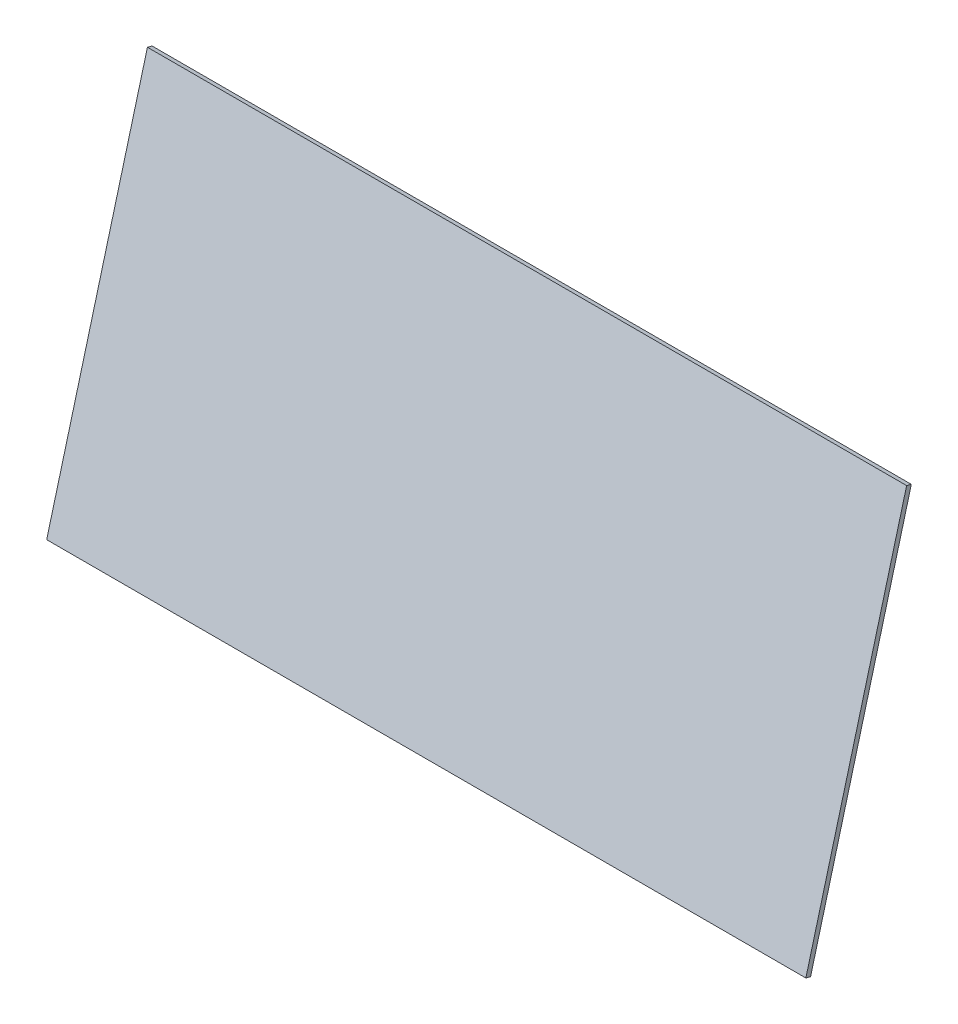
ISO-10303-21;
HEADER;
FILE_DESCRIPTION(('STEP AP214'),'2;1');
FILE_NAME('part.step','',(''),(''),'','','');
FILE_SCHEMA(('AUTOMOTIVE_DESIGN { 1 0 10303 214 1 1 1 1 }'));
ENDSEC;
DATA;
#1=APPLICATION_CONTEXT('core data for automotive mechanical design processes');
#2=APPLICATION_PROTOCOL_DEFINITION('international standard','automotive_design',2000,#1);
#3=PRODUCT_CONTEXT('',#1,'mechanical');
#4=PRODUCT('Part','Part','',(#3));
#5=PRODUCT_RELATED_PRODUCT_CATEGORY('part','',(#4));
#6=PRODUCT_DEFINITION_FORMATION('','',#4);
#7=PRODUCT_DEFINITION_CONTEXT('part definition',#1,'design');
#8=PRODUCT_DEFINITION('design','',#6,#7);
#9=PRODUCT_DEFINITION_SHAPE('','',#8);
#10=(LENGTH_UNIT() NAMED_UNIT(*) SI_UNIT(.MILLI.,.METRE.));
#11=(NAMED_UNIT(*) PLANE_ANGLE_UNIT() SI_UNIT($,.RADIAN.));
#12=(NAMED_UNIT(*) SI_UNIT($,.STERADIAN.) SOLID_ANGLE_UNIT());
#13=UNCERTAINTY_MEASURE_WITH_UNIT(LENGTH_MEASURE(1.E-05),#10,'distance_accuracy_value','');
#14=(GEOMETRIC_REPRESENTATION_CONTEXT(3) GLOBAL_UNCERTAINTY_ASSIGNED_CONTEXT((#13)) GLOBAL_UNIT_ASSIGNED_CONTEXT((#10,
#11,#12)) REPRESENTATION_CONTEXT('',''));
#15=CARTESIAN_POINT('',(0.,0.,0.));
#16=DIRECTION('',(0.,0.,1.));
#17=DIRECTION('',(1.,0.,0.));
#18=AXIS2_PLACEMENT_3D('',#15,#16,#17);
#19=CARTESIAN_POINT('',(-78.,-0.129409522551259,-0.482962913144535));
#20=DIRECTION('',(0.,-0.258819045102518,-0.965925826289069));
#21=DIRECTION('',(0.,0.965925826289069,-0.258819045102518));
#22=AXIS2_PLACEMENT_3D('',#19,#20,#21);
#23=PLANE('',#22);
#24=DIRECTION('',(0.,0.965925826289069,-0.258819045102518));
#25=VECTOR('',#24,1.);
#26=CARTESIAN_POINT('',(0.,-0.129409522551259,-0.482962913144535));
#27=LINE('',#26,#25);
#28=CARTESIAN_POINT('',(0.,-0.129409522551259,-0.482962913144535));
#29=VERTEX_POINT('',#28);
#30=CARTESIAN_POINT('',(0.,38.5076235290115,-10.8357247172452));
#31=VERTEX_POINT('',#30);
#32=EDGE_CURVE('E97',#29,#31,#27,.T.);
#33=ORIENTED_EDGE('',*,*,#32,.F.);
#34=DIRECTION('',(1.,0.,0.));
#35=VECTOR('',#34,1.);
#36=CARTESIAN_POINT('',(-78.,-0.129409522551259,-0.482962913144535));
#37=LINE('',#36,#35);
#38=CARTESIAN_POINT('',(-78.,-0.129409522551259,-0.482962913144535));
#39=VERTEX_POINT('',#38);
#40=EDGE_CURVE('E11',#39,#29,#37,.T.);
#41=ORIENTED_EDGE('',*,*,#40,.F.);
#42=DIRECTION('',(0.,0.965925826289069,-0.258819045102518));
#43=VECTOR('',#42,1.);
#44=CARTESIAN_POINT('',(-78.,-0.129409522551259,-0.482962913144535));
#45=LINE('',#44,#43);
#46=CARTESIAN_POINT('',(-78.,38.5076235290115,-10.8357247172452));
#47=VERTEX_POINT('',#46);
#48=EDGE_CURVE('E92',#39,#47,#45,.T.);
#49=ORIENTED_EDGE('',*,*,#48,.T.);
#50=DIRECTION('',(1.,0.,0.));
#51=VECTOR('',#50,1.);
#52=CARTESIAN_POINT('',(-78.,38.5076235290115,-10.8357247172452));
#53=LINE('',#52,#51);
#54=EDGE_CURVE('E35',#47,#31,#53,.T.);
#55=ORIENTED_EDGE('',*,*,#54,.T.);
#56=EDGE_LOOP('',(#33,#41,#49,#55));
#57=FACE_BOUND('',#56,.T.);
#58=ADVANCED_FACE('F32',(#57),#23,.T.);
#59=CARTESIAN_POINT('',(-78.,-0.129409522551259,-0.482962913144535));
#60=DIRECTION('',(0.,0.965925826289069,-0.258819045102518));
#61=DIRECTION('',(0.,0.258819045102518,0.965925826289069));
#62=AXIS2_PLACEMENT_3D('',#59,#60,#61);
#63=PLANE('',#62);
#64=DIRECTION('',(0.,0.258819045102518,0.965925826289069));
#65=VECTOR('',#64,1.);
#66=CARTESIAN_POINT('',(0.,-0.129409522551259,-0.482962913144535));
#67=LINE('',#66,#65);
#68=CARTESIAN_POINT('',(0.,0.,0.));
#69=VERTEX_POINT('',#68);
#70=EDGE_CURVE('E65',#29,#69,#67,.T.);
#71=ORIENTED_EDGE('',*,*,#70,.T.);
#72=DIRECTION('',(1.,0.,0.));
#73=VECTOR('',#72,1.);
#74=CARTESIAN_POINT('',(-78.,0.,0.));
#75=LINE('',#74,#73);
#76=CARTESIAN_POINT('',(-78.,0.,0.));
#77=VERTEX_POINT('',#76);
#78=EDGE_CURVE('E41',#77,#69,#75,.T.);
#79=ORIENTED_EDGE('',*,*,#78,.F.);
#80=DIRECTION('',(0.,0.258819045102518,0.965925826289069));
#81=VECTOR('',#80,1.);
#82=CARTESIAN_POINT('',(-78.,-0.129409522551259,-0.482962913144535));
#83=LINE('',#82,#81);
#84=EDGE_CURVE('E80',#39,#77,#83,.T.);
#85=ORIENTED_EDGE('',*,*,#84,.F.);
#86=ORIENTED_EDGE('',*,*,#40,.T.);
#87=EDGE_LOOP('',(#71,#79,#85,#86));
#88=FACE_BOUND('',#87,.T.);
#89=ADVANCED_FACE('F107',(#88),#63,.F.);
#90=CARTESIAN_POINT('',(-78.,0.,0.));
#91=DIRECTION('',(0.,-0.258819045102518,-0.965925826289069));
#92=DIRECTION('',(0.,0.965925826289069,-0.258819045102518));
#93=AXIS2_PLACEMENT_3D('',#90,#91,#92);
#94=PLANE('',#93);
#95=DIRECTION('',(0.,0.965925826289069,-0.258819045102518));
#96=VECTOR('',#95,1.);
#97=CARTESIAN_POINT('',(0.,0.,0.));
#98=LINE('',#97,#96);
#99=CARTESIAN_POINT('',(0.,38.6370330515628,-10.3527618041007));
#100=VERTEX_POINT('',#99);
#101=EDGE_CURVE('E87',#69,#100,#98,.T.);
#102=ORIENTED_EDGE('',*,*,#101,.T.);
#103=DIRECTION('',(1.,0.,0.));
#104=VECTOR('',#103,1.);
#105=CARTESIAN_POINT('',(-78.,38.6370330515628,-10.3527618041007));
#106=LINE('',#105,#104);
#107=CARTESIAN_POINT('',(-78.,38.6370330515628,-10.3527618041007));
#108=VERTEX_POINT('',#107);
#109=EDGE_CURVE('E84',#108,#100,#106,.T.);
#110=ORIENTED_EDGE('',*,*,#109,.F.);
#111=DIRECTION('',(0.,0.965925826289069,-0.258819045102518));
#112=VECTOR('',#111,1.);
#113=CARTESIAN_POINT('',(-78.,0.,0.));
#114=LINE('',#113,#112);
#115=EDGE_CURVE('E77',#77,#108,#114,.T.);
#116=ORIENTED_EDGE('',*,*,#115,.F.);
#117=ORIENTED_EDGE('',*,*,#78,.T.);
#118=EDGE_LOOP('',(#102,#110,#116,#117));
#119=FACE_BOUND('',#118,.T.);
#120=ADVANCED_FACE('F85',(#119),#94,.F.);
#121=CARTESIAN_POINT('',(-78.,38.6370330515628,-10.3527618041007));
#122=DIRECTION('',(0.,-0.965925826289078,0.258819045102486));
#123=DIRECTION('',(0.,-0.258819045102486,-0.965925826289078));
#124=AXIS2_PLACEMENT_3D('',#121,#122,#123);
#125=PLANE('',#124);
#126=DIRECTION('',(0.,-0.258819045102486,-0.965925826289078));
#127=VECTOR('',#126,1.);
#128=CARTESIAN_POINT('',(0.,38.6370330515628,-10.3527618041007));
#129=LINE('',#128,#127);
#130=EDGE_CURVE('E100',#100,#31,#129,.T.);
#131=ORIENTED_EDGE('',*,*,#130,.T.);
#132=ORIENTED_EDGE('',*,*,#54,.F.);
#133=DIRECTION('',(0.,-0.258819045102486,-0.965925826289078));
#134=VECTOR('',#133,1.);
#135=CARTESIAN_POINT('',(-78.,38.6370330515628,-10.3527618041007));
#136=LINE('',#135,#134);
#137=EDGE_CURVE('E74',#108,#47,#136,.T.);
#138=ORIENTED_EDGE('',*,*,#137,.F.);
#139=ORIENTED_EDGE('',*,*,#109,.T.);
#140=EDGE_LOOP('',(#131,#132,#138,#139));
#141=FACE_BOUND('',#140,.T.);
#142=ADVANCED_FACE('F91',(#141),#125,.F.);
#143=CARTESIAN_POINT('',(-78.,0.,0.));
#144=DIRECTION('',(-1.,0.,0.));
#145=DIRECTION('',(0.,0.,1.));
#146=AXIS2_PLACEMENT_3D('',#143,#144,#145);
#147=PLANE('',#146);
#148=ORIENTED_EDGE('',*,*,#48,.F.);
#149=ORIENTED_EDGE('',*,*,#84,.T.);
#150=ORIENTED_EDGE('',*,*,#115,.T.);
#151=ORIENTED_EDGE('',*,*,#137,.T.);
#152=EDGE_LOOP('',(#148,#149,#150,#151));
#153=FACE_BOUND('',#152,.T.);
#154=ADVANCED_FACE('F79',(#153),#147,.T.);
#155=CARTESIAN_POINT('',(0.,0.,0.));
#156=DIRECTION('',(-1.,0.,0.));
#157=DIRECTION('',(0.,0.,1.));
#158=AXIS2_PLACEMENT_3D('',#155,#156,#157);
#159=PLANE('',#158);
#160=ORIENTED_EDGE('',*,*,#32,.T.);
#161=ORIENTED_EDGE('',*,*,#130,.F.);
#162=ORIENTED_EDGE('',*,*,#101,.F.);
#163=ORIENTED_EDGE('',*,*,#70,.F.);
#164=EDGE_LOOP('',(#160,#161,#162,#163));
#165=FACE_BOUND('',#164,.T.);
#166=ADVANCED_FACE('F105',(#165),#159,.F.);
#167=CLOSED_SHELL('',(#58,#89,#120,#142,#154,#166));
#168=MANIFOLD_SOLID_BREP('B2',#167);
#169=ADVANCED_BREP_SHAPE_REPRESENTATION('',(#18,#168),#14);
#170=SHAPE_DEFINITION_REPRESENTATION(#9,#169);
ENDSEC;
END-ISO-10303-21;
